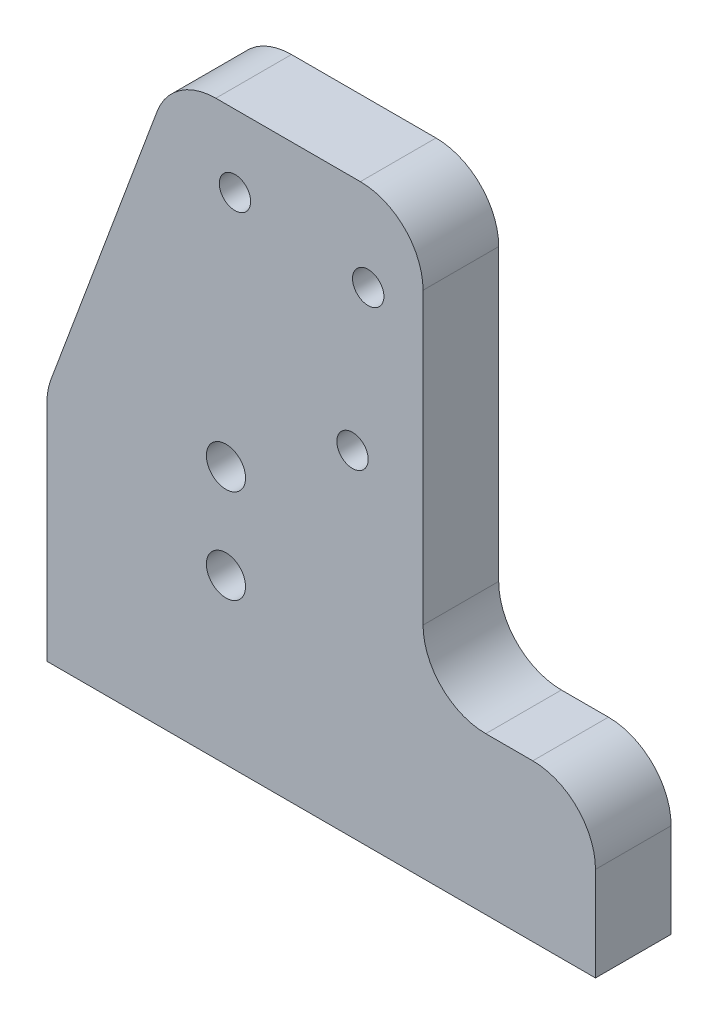
ISO-10303-21;
HEADER;
FILE_DESCRIPTION(('STEP AP214'),'2;1');
FILE_NAME('part.step','',(''),(''),'','','');
FILE_SCHEMA(('AUTOMOTIVE_DESIGN { 1 0 10303 214 1 1 1 1 }'));
ENDSEC;
DATA;
#1=APPLICATION_CONTEXT('core data for automotive mechanical design processes');
#2=APPLICATION_PROTOCOL_DEFINITION('international standard','automotive_design',2000,#1);
#3=PRODUCT_CONTEXT('',#1,'mechanical');
#4=PRODUCT('Part','Part','',(#3));
#5=PRODUCT_RELATED_PRODUCT_CATEGORY('part','',(#4));
#6=PRODUCT_DEFINITION_FORMATION('','',#4);
#7=PRODUCT_DEFINITION_CONTEXT('part definition',#1,'design');
#8=PRODUCT_DEFINITION('design','',#6,#7);
#9=PRODUCT_DEFINITION_SHAPE('','',#8);
#10=(LENGTH_UNIT() NAMED_UNIT(*) SI_UNIT(.MILLI.,.METRE.));
#11=(NAMED_UNIT(*) PLANE_ANGLE_UNIT() SI_UNIT($,.RADIAN.));
#12=(NAMED_UNIT(*) SI_UNIT($,.STERADIAN.) SOLID_ANGLE_UNIT());
#13=UNCERTAINTY_MEASURE_WITH_UNIT(LENGTH_MEASURE(1.E-05),#10,'distance_accuracy_value','');
#14=(GEOMETRIC_REPRESENTATION_CONTEXT(3) GLOBAL_UNCERTAINTY_ASSIGNED_CONTEXT((#13)) GLOBAL_UNIT_ASSIGNED_CONTEXT((#10,
#11,#12)) REPRESENTATION_CONTEXT('',''));
#15=CARTESIAN_POINT('',(0.,0.,0.));
#16=DIRECTION('',(0.,0.,1.));
#17=DIRECTION('',(1.,0.,0.));
#18=AXIS2_PLACEMENT_3D('',#15,#16,#17);
#19=CARTESIAN_POINT('',(16.73,5.,7.239));
#20=DIRECTION('',(0.,-1.,0.));
#21=DIRECTION('',(0.,0.,1.));
#22=AXIS2_PLACEMENT_3D('',#19,#20,#21);
#23=CONICAL_SURFACE('',#22,1.25,1.02974425867665);
#24=CARTESIAN_POINT('',(16.73,5.75107577378445,7.239));
#25=VERTEX_POINT('',#24);
#26=VERTEX_LOOP('',#25);
#27=FACE_BOUND('',#26,.T.);
#28=CARTESIAN_POINT('',(16.73,5.,7.239));
#29=DIRECTION('',(0.,1.,0.));
#30=DIRECTION('',(0.,0.,1.));
#31=AXIS2_PLACEMENT_3D('',#28,#29,#30);
#32=CIRCLE('',#31,1.25);
#33=CARTESIAN_POINT('',(16.73,5.,8.489));
#34=VERTEX_POINT('',#33);
#35=EDGE_CURVE('E191',#34,#34,#32,.T.);
#36=ORIENTED_EDGE('',*,*,#35,.F.);
#37=EDGE_LOOP('',(#36));
#38=FACE_BOUND('',#37,.T.);
#39=ADVANCED_FACE('F49',(#27,#38),#23,.F.);
#40=CARTESIAN_POINT('',(16.73,0.,7.239));
#41=DIRECTION('',(0.,-1.,0.));
#42=DIRECTION('',(0.,0.,1.));
#43=AXIS2_PLACEMENT_3D('',#40,#41,#42);
#44=CYLINDRICAL_SURFACE('',#43,1.24999999999999);
#45=ORIENTED_EDGE('',*,*,#35,.T.);
#46=EDGE_LOOP('',(#45));
#47=FACE_BOUND('',#46,.T.);
#48=CARTESIAN_POINT('',(16.73,-1.5,7.239));
#49=DIRECTION('',(0.,1.,0.));
#50=DIRECTION('',(1.,0.,0.));
#51=AXIS2_PLACEMENT_3D('',#48,#49,#50);
#52=CIRCLE('',#51,1.24999999999999);
#53=CARTESIAN_POINT('',(17.98,-1.5,7.239));
#54=VERTEX_POINT('',#53);
#55=EDGE_CURVE('E172',#54,#54,#52,.T.);
#56=ORIENTED_EDGE('',*,*,#55,.F.);
#57=EDGE_LOOP('',(#56));
#58=FACE_BOUND('',#57,.T.);
#59=ADVANCED_FACE('F297',(#47,#58),#44,.F.);
#60=CARTESIAN_POINT('',(0.,-1.5,9.652));
#61=DIRECTION('',(0.,1.,0.));
#62=DIRECTION('',(-1.,0.,0.));
#63=AXIS2_PLACEMENT_3D('',#60,#61,#62);
#64=PLANE('',#63);
#65=DIRECTION('',(0.,0.,1.));
#66=VECTOR('',#65,1.);
#67=CARTESIAN_POINT('',(0.,-1.5,9.652));
#68=LINE('',#67,#66);
#69=CARTESIAN_POINT('',(0.,-1.5,4.826));
#70=VERTEX_POINT('',#69);
#71=CARTESIAN_POINT('',(0.,-1.5,9.652));
#72=VERTEX_POINT('',#71);
#73=EDGE_CURVE('E165',#70,#72,#68,.T.);
#74=ORIENTED_EDGE('',*,*,#73,.F.);
#75=DIRECTION('',(-1.,0.,0.));
#76=VECTOR('',#75,1.);
#77=CARTESIAN_POINT('',(0.,-1.5,4.826));
#78=LINE('',#77,#76);
#79=CARTESIAN_POINT('',(35.,-1.5,4.826));
#80=VERTEX_POINT('',#79);
#81=EDGE_CURVE('E180',#80,#70,#78,.T.);
#82=ORIENTED_EDGE('',*,*,#81,.F.);
#83=DIRECTION('',(0.,0.,-1.));
#84=VECTOR('',#83,1.);
#85=CARTESIAN_POINT('',(35.,-1.5,9.652));
#86=LINE('',#85,#84);
#87=CARTESIAN_POINT('',(35.,-1.5,9.652));
#88=VERTEX_POINT('',#87);
#89=EDGE_CURVE('E167',#88,#80,#86,.T.);
#90=ORIENTED_EDGE('',*,*,#89,.F.);
#91=DIRECTION('',(1.,0.,0.));
#92=VECTOR('',#91,1.);
#93=CARTESIAN_POINT('',(0.,-1.5,9.652));
#94=LINE('',#93,#92);
#95=EDGE_CURVE('E149',#72,#88,#94,.T.);
#96=ORIENTED_EDGE('',*,*,#95,.F.);
#97=EDGE_LOOP('',(#74,#82,#90,#96));
#98=FACE_BOUND('',#97,.T.);
#99=ORIENTED_EDGE('',*,*,#55,.T.);
#100=EDGE_LOOP('',(#99));
#101=FACE_BOUND('',#100,.T.);
#102=CARTESIAN_POINT('',(28.73,-1.5,7.239));
#103=DIRECTION('',(0.,1.,0.));
#104=DIRECTION('',(1.,0.,0.));
#105=AXIS2_PLACEMENT_3D('',#102,#103,#104);
#106=CIRCLE('',#105,1.25);
#107=CARTESIAN_POINT('',(29.98,-1.5,7.239));
#108=VERTEX_POINT('',#107);
#109=EDGE_CURVE('E175',#108,#108,#106,.T.);
#110=ORIENTED_EDGE('',*,*,#109,.T.);
#111=EDGE_LOOP('',(#110));
#112=FACE_BOUND('',#111,.T.);
#113=ADVANCED_FACE('F162',(#98,#101,#112),#64,.F.);
#114=CARTESIAN_POINT('',(10.7795608360761,31.,4.826));
#115=DIRECTION('',(0.,0.,-1.));
#116=DIRECTION('',(1.,0.,0.));
#117=AXIS2_PLACEMENT_3D('',#114,#115,#116);
#118=CYLINDRICAL_SURFACE('',#117,4.);
#119=CARTESIAN_POINT('',(10.7795608360761,31.,4.826));
#120=DIRECTION('',(0.,0.,1.));
#121=DIRECTION('',(1.,0.,0.));
#122=AXIS2_PLACEMENT_3D('',#119,#120,#121);
#123=CIRCLE('',#122,4.);
#124=CARTESIAN_POINT('',(10.7795608360761,35.,4.826));
#125=VERTEX_POINT('',#124);
#126=CARTESIAN_POINT('',(7.03067343184584,32.3949348480857,4.826));
#127=VERTEX_POINT('',#126);
#128=EDGE_CURVE('E249',#125,#127,#123,.T.);
#129=ORIENTED_EDGE('',*,*,#128,.T.);
#130=DIRECTION('',(0.,0.,1.));
#131=VECTOR('',#130,1.);
#132=CARTESIAN_POINT('',(7.03067343184583,32.3949348480857,9.652));
#133=LINE('',#132,#131);
#134=CARTESIAN_POINT('',(7.03067343184584,32.3949348480857,9.652));
#135=VERTEX_POINT('',#134);
#136=EDGE_CURVE('E239',#127,#135,#133,.T.);
#137=ORIENTED_EDGE('',*,*,#136,.T.);
#138=CARTESIAN_POINT('',(10.7795608360761,31.,9.652));
#139=DIRECTION('',(0.,0.,1.));
#140=DIRECTION('',(1.,0.,0.));
#141=AXIS2_PLACEMENT_3D('',#138,#139,#140);
#142=CIRCLE('',#141,4.);
#143=CARTESIAN_POINT('',(10.7795608360761,35.,9.652));
#144=VERTEX_POINT('',#143);
#145=EDGE_CURVE('E235',#135,#144,#142,.F.);
#146=ORIENTED_EDGE('',*,*,#145,.T.);
#147=DIRECTION('',(0.,0.,1.));
#148=VECTOR('',#147,1.);
#149=CARTESIAN_POINT('',(10.7795608360761,35.,4.826));
#150=LINE('',#149,#148);
#151=EDGE_CURVE('E258',#144,#125,#150,.F.);
#152=ORIENTED_EDGE('',*,*,#151,.T.);
#153=EDGE_LOOP('',(#129,#137,#146,#152));
#154=FACE_BOUND('',#153,.T.);
#155=ADVANCED_FACE('F365',(#154),#118,.T.);
#156=CARTESIAN_POINT('',(0.,35.,4.826));
#157=DIRECTION('',(0.,1.,0.));
#158=DIRECTION('',(-1.,0.,0.));
#159=AXIS2_PLACEMENT_3D('',#156,#157,#158);
#160=PLANE('',#159);
#161=DIRECTION('',(1.,0.,0.));
#162=VECTOR('',#161,1.);
#163=CARTESIAN_POINT('',(0.,35.,9.652));
#164=LINE('',#163,#162);
#165=CARTESIAN_POINT('',(20.,35.,9.652));
#166=VERTEX_POINT('',#165);
#167=EDGE_CURVE('E203',#144,#166,#164,.T.);
#168=ORIENTED_EDGE('',*,*,#167,.T.);
#169=DIRECTION('',(0.,0.,1.));
#170=VECTOR('',#169,1.);
#171=CARTESIAN_POINT('',(20.,35.,4.826));
#172=LINE('',#171,#170);
#173=CARTESIAN_POINT('',(20.,35.,4.826));
#174=VERTEX_POINT('',#173);
#175=EDGE_CURVE('E255',#174,#166,#172,.T.);
#176=ORIENTED_EDGE('',*,*,#175,.F.);
#177=DIRECTION('',(1.,0.,0.));
#178=VECTOR('',#177,1.);
#179=CARTESIAN_POINT('',(0.,35.,4.826));
#180=LINE('',#179,#178);
#181=EDGE_CURVE('E204',#125,#174,#180,.T.);
#182=ORIENTED_EDGE('',*,*,#181,.F.);
#183=ORIENTED_EDGE('',*,*,#151,.F.);
#184=EDGE_LOOP('',(#168,#176,#182,#183));
#185=FACE_BOUND('',#184,.T.);
#186=ADVANCED_FACE('F293',(#185),#160,.T.);
#187=CARTESIAN_POINT('',(20.,31.,4.826));
#188=DIRECTION('',(0.,0.,1.));
#189=DIRECTION('',(-1.,0.,0.));
#190=AXIS2_PLACEMENT_3D('',#187,#188,#189);
#191=CYLINDRICAL_SURFACE('',#190,4.);
#192=CARTESIAN_POINT('',(20.,31.,4.826));
#193=DIRECTION('',(0.,0.,1.));
#194=DIRECTION('',(1.,0.,0.));
#195=AXIS2_PLACEMENT_3D('',#192,#193,#194);
#196=CIRCLE('',#195,4.);
#197=CARTESIAN_POINT('',(24.,31.,4.826));
#198=VERTEX_POINT('',#197);
#199=EDGE_CURVE('E245',#198,#174,#196,.T.);
#200=ORIENTED_EDGE('',*,*,#199,.T.);
#201=ORIENTED_EDGE('',*,*,#175,.T.);
#202=CARTESIAN_POINT('',(20.,31.,9.652));
#203=DIRECTION('',(0.,0.,1.));
#204=DIRECTION('',(1.,0.,0.));
#205=AXIS2_PLACEMENT_3D('',#202,#203,#204);
#206=CIRCLE('',#205,4.);
#207=CARTESIAN_POINT('',(24.,31.,9.652));
#208=VERTEX_POINT('',#207);
#209=EDGE_CURVE('E229',#166,#208,#206,.F.);
#210=ORIENTED_EDGE('',*,*,#209,.T.);
#211=DIRECTION('',(0.,0.,1.));
#212=VECTOR('',#211,1.);
#213=CARTESIAN_POINT('',(24.,31.,4.826));
#214=LINE('',#213,#212);
#215=EDGE_CURVE('E269',#208,#198,#214,.F.);
#216=ORIENTED_EDGE('',*,*,#215,.T.);
#217=EDGE_LOOP('',(#200,#201,#210,#216));
#218=FACE_BOUND('',#217,.T.);
#219=ADVANCED_FACE('F51',(#218),#191,.T.);
#220=CARTESIAN_POINT('',(24.,0.,4.826));
#221=DIRECTION('',(1.,0.,0.));
#222=DIRECTION('',(0.,1.,0.));
#223=AXIS2_PLACEMENT_3D('',#220,#221,#222);
#224=PLANE('',#223);
#225=DIRECTION('',(0.,-1.,0.));
#226=VECTOR('',#225,1.);
#227=CARTESIAN_POINT('',(24.,0.,4.826));
#228=LINE('',#227,#226);
#229=CARTESIAN_POINT('',(24.,12.5,4.826));
#230=VERTEX_POINT('',#229);
#231=EDGE_CURVE('E70',#198,#230,#228,.T.);
#232=ORIENTED_EDGE('',*,*,#231,.F.);
#233=ORIENTED_EDGE('',*,*,#215,.F.);
#234=DIRECTION('',(0.,-1.,0.));
#235=VECTOR('',#234,1.);
#236=CARTESIAN_POINT('',(24.,0.,9.652));
#237=LINE('',#236,#235);
#238=CARTESIAN_POINT('',(24.,12.5,9.652));
#239=VERTEX_POINT('',#238);
#240=EDGE_CURVE('E208',#208,#239,#237,.T.);
#241=ORIENTED_EDGE('',*,*,#240,.T.);
#242=DIRECTION('',(0.,0.,1.));
#243=VECTOR('',#242,1.);
#244=CARTESIAN_POINT('',(24.,12.5,9.652));
#245=LINE('',#244,#243);
#246=EDGE_CURVE('E271',#230,#239,#245,.T.);
#247=ORIENTED_EDGE('',*,*,#246,.F.);
#248=EDGE_LOOP('',(#232,#233,#241,#247));
#249=FACE_BOUND('',#248,.T.);
#250=ADVANCED_FACE('F286',(#249),#224,.T.);
#251=CARTESIAN_POINT('',(28.,12.5,4.826));
#252=DIRECTION('',(0.,0.,-1.));
#253=DIRECTION('',(1.,0.,0.));
#254=AXIS2_PLACEMENT_3D('',#251,#252,#253);
#255=CYLINDRICAL_SURFACE('',#254,4.);
#256=CARTESIAN_POINT('',(28.,12.5,4.826));
#257=DIRECTION('',(0.,0.,1.));
#258=DIRECTION('',(1.,0.,0.));
#259=AXIS2_PLACEMENT_3D('',#256,#257,#258);
#260=CIRCLE('',#259,4.);
#261=CARTESIAN_POINT('',(28.,8.5,4.826));
#262=VERTEX_POINT('',#261);
#263=EDGE_CURVE('E11',#262,#230,#260,.F.);
#264=ORIENTED_EDGE('',*,*,#263,.T.);
#265=ORIENTED_EDGE('',*,*,#246,.T.);
#266=CARTESIAN_POINT('',(28.,12.5,9.652));
#267=DIRECTION('',(0.,0.,1.));
#268=DIRECTION('',(1.,0.,0.));
#269=AXIS2_PLACEMENT_3D('',#266,#267,#268);
#270=CIRCLE('',#269,4.);
#271=CARTESIAN_POINT('',(28.,8.5,9.652));
#272=VERTEX_POINT('',#271);
#273=EDGE_CURVE('E58',#239,#272,#270,.T.);
#274=ORIENTED_EDGE('',*,*,#273,.T.);
#275=DIRECTION('',(0.,0.,1.));
#276=VECTOR('',#275,1.);
#277=CARTESIAN_POINT('',(28.,8.5,4.826));
#278=LINE('',#277,#276);
#279=EDGE_CURVE('E261',#272,#262,#278,.F.);
#280=ORIENTED_EDGE('',*,*,#279,.T.);
#281=EDGE_LOOP('',(#264,#265,#274,#280));
#282=FACE_BOUND('',#281,.T.);
#283=ADVANCED_FACE('F274',(#282),#255,.F.);
#284=CARTESIAN_POINT('',(0.,8.5,4.826));
#285=DIRECTION('',(0.,1.,0.));
#286=DIRECTION('',(0.,0.,-1.));
#287=AXIS2_PLACEMENT_3D('',#284,#285,#286);
#288=PLANE('',#287);
#289=DIRECTION('',(1.,0.,0.));
#290=VECTOR('',#289,1.);
#291=CARTESIAN_POINT('',(0.,8.5,4.826));
#292=LINE('',#291,#290);
#293=CARTESIAN_POINT('',(31.,8.5,4.826));
#294=VERTEX_POINT('',#293);
#295=EDGE_CURVE('E214',#262,#294,#292,.T.);
#296=ORIENTED_EDGE('',*,*,#295,.F.);
#297=ORIENTED_EDGE('',*,*,#279,.F.);
#298=DIRECTION('',(1.,0.,0.));
#299=VECTOR('',#298,1.);
#300=CARTESIAN_POINT('',(0.,8.5,9.652));
#301=LINE('',#300,#299);
#302=CARTESIAN_POINT('',(31.,8.5,9.652));
#303=VERTEX_POINT('',#302);
#304=EDGE_CURVE('E223',#272,#303,#301,.T.);
#305=ORIENTED_EDGE('',*,*,#304,.T.);
#306=DIRECTION('',(0.,0.,1.));
#307=VECTOR('',#306,1.);
#308=CARTESIAN_POINT('',(31.,8.5,4.826));
#309=LINE('',#308,#307);
#310=EDGE_CURVE('E263',#294,#303,#309,.T.);
#311=ORIENTED_EDGE('',*,*,#310,.F.);
#312=EDGE_LOOP('',(#296,#297,#305,#311));
#313=FACE_BOUND('',#312,.T.);
#314=ADVANCED_FACE('F278',(#313),#288,.T.);
#315=CARTESIAN_POINT('',(31.,4.5,4.826));
#316=DIRECTION('',(0.,0.,1.));
#317=DIRECTION('',(-1.,0.,0.));
#318=AXIS2_PLACEMENT_3D('',#315,#316,#317);
#319=CYLINDRICAL_SURFACE('',#318,4.);
#320=CARTESIAN_POINT('',(31.,4.5,4.826));
#321=DIRECTION('',(0.,0.,1.));
#322=DIRECTION('',(1.,0.,0.));
#323=AXIS2_PLACEMENT_3D('',#320,#321,#322);
#324=CIRCLE('',#323,4.);
#325=CARTESIAN_POINT('',(35.,4.5,4.826));
#326=VERTEX_POINT('',#325);
#327=EDGE_CURVE('E247',#326,#294,#324,.T.);
#328=ORIENTED_EDGE('',*,*,#327,.T.);
#329=ORIENTED_EDGE('',*,*,#310,.T.);
#330=CARTESIAN_POINT('',(31.,4.5,9.652));
#331=DIRECTION('',(0.,0.,1.));
#332=DIRECTION('',(1.,0.,0.));
#333=AXIS2_PLACEMENT_3D('',#330,#331,#332);
#334=CIRCLE('',#333,4.);
#335=CARTESIAN_POINT('',(35.,4.5,9.652));
#336=VERTEX_POINT('',#335);
#337=EDGE_CURVE('E232',#303,#336,#334,.F.);
#338=ORIENTED_EDGE('',*,*,#337,.T.);
#339=DIRECTION('',(0.,0.,1.));
#340=VECTOR('',#339,1.);
#341=CARTESIAN_POINT('',(35.,4.5,4.826));
#342=LINE('',#341,#340);
#343=EDGE_CURVE('E266',#336,#326,#342,.F.);
#344=ORIENTED_EDGE('',*,*,#343,.T.);
#345=EDGE_LOOP('',(#328,#329,#338,#344));
#346=FACE_BOUND('',#345,.T.);
#347=ADVANCED_FACE('F469',(#346),#319,.T.);
#348=CARTESIAN_POINT('',(-4.41235154394299,1.64180522565321,4.826));
#349=DIRECTION('',(0.937221851057562,-0.348733712021418,0.));
#350=DIRECTION('',(0.348733712021418,0.937221851057562,0.));
#351=AXIS2_PLACEMENT_3D('',#348,#349,#350);
#352=PLANE('',#351);
#353=DIRECTION('',(-0.348733712021418,-0.937221851057562,0.));
#354=VECTOR('',#353,1.);
#355=CARTESIAN_POINT('',(-4.41235154394299,1.64180522565321,9.652));
#356=LINE('',#355,#354);
#357=CARTESIAN_POINT('',(0.251112595769755,14.1748651011312,9.652));
#358=VERTEX_POINT('',#357);
#359=EDGE_CURVE('E158',#135,#358,#356,.T.);
#360=ORIENTED_EDGE('',*,*,#359,.F.);
#361=ORIENTED_EDGE('',*,*,#136,.F.);
#362=DIRECTION('',(-0.348733712021418,-0.937221851057562,0.));
#363=VECTOR('',#362,1.);
#364=CARTESIAN_POINT('',(-4.41235154394299,1.64180522565321,4.826));
#365=LINE('',#364,#363);
#366=CARTESIAN_POINT('',(0.251112595769755,14.1748651011312,4.826));
#367=VERTEX_POINT('',#366);
#368=EDGE_CURVE('E207',#127,#367,#365,.T.);
#369=ORIENTED_EDGE('',*,*,#368,.T.);
#370=DIRECTION('',(0.,0.,1.));
#371=VECTOR('',#370,1.);
#372=CARTESIAN_POINT('',(0.251112595769752,14.1748651011312,4.826));
#373=LINE('',#372,#371);
#374=EDGE_CURVE('E242',#358,#367,#373,.F.);
#375=ORIENTED_EDGE('',*,*,#374,.F.);
#376=EDGE_LOOP('',(#360,#361,#369,#375));
#377=FACE_BOUND('',#376,.T.);
#378=ADVANCED_FACE('F321',(#377),#352,.F.);
#379=CARTESIAN_POINT('',(12.,30.4,4.826));
#380=DIRECTION('',(0.,0.,-1.));
#381=DIRECTION('',(1.,0.,0.));
#382=AXIS2_PLACEMENT_3D('',#379,#380,#381);
#383=CYLINDRICAL_SURFACE('',#382,0.999999999999999);
#384=CARTESIAN_POINT('',(12.,30.4,9.652));
#385=DIRECTION('',(0.,0.,1.));
#386=DIRECTION('',(1.,0.,0.));
#387=AXIS2_PLACEMENT_3D('',#384,#385,#386);
#388=CIRCLE('',#387,0.999999999999999);
#389=CARTESIAN_POINT('',(13.,30.4,9.652));
#390=VERTEX_POINT('',#389);
#391=EDGE_CURVE('E200',#390,#390,#388,.T.);
#392=ORIENTED_EDGE('',*,*,#391,.T.);
#393=EDGE_LOOP('',(#392));
#394=FACE_BOUND('',#393,.T.);
#395=CARTESIAN_POINT('',(12.,30.4,4.826));
#396=DIRECTION('',(0.,0.,1.));
#397=DIRECTION('',(1.,0.,0.));
#398=AXIS2_PLACEMENT_3D('',#395,#396,#397);
#399=CIRCLE('',#398,0.999999999999999);
#400=CARTESIAN_POINT('',(13.,30.4,4.826));
#401=VERTEX_POINT('',#400);
#402=EDGE_CURVE('E197',#401,#401,#399,.T.);
#403=ORIENTED_EDGE('',*,*,#402,.F.);
#404=EDGE_LOOP('',(#403));
#405=FACE_BOUND('',#404,.T.);
#406=ADVANCED_FACE('F317',(#394,#405),#383,.F.);
#407=CARTESIAN_POINT('',(19.5,19.9,14.826));
#408=DIRECTION('',(0.,0.,-1.));
#409=DIRECTION('',(1.,0.,0.));
#410=AXIS2_PLACEMENT_3D('',#407,#408,#409);
#411=CYLINDRICAL_SURFACE('',#410,1.);
#412=CARTESIAN_POINT('',(19.5,19.9,4.826));
#413=DIRECTION('',(0.,0.,1.));
#414=DIRECTION('',(1.,0.,0.));
#415=AXIS2_PLACEMENT_3D('',#412,#413,#414);
#416=CIRCLE('',#415,1.);
#417=CARTESIAN_POINT('',(20.5,19.9,4.826));
#418=VERTEX_POINT('',#417);
#419=EDGE_CURVE('E186',#418,#418,#416,.T.);
#420=ORIENTED_EDGE('',*,*,#419,.F.);
#421=EDGE_LOOP('',(#420));
#422=FACE_BOUND('',#421,.T.);
#423=CARTESIAN_POINT('',(19.5,19.9,9.652));
#424=DIRECTION('',(0.,0.,1.));
#425=DIRECTION('',(1.,0.,0.));
#426=AXIS2_PLACEMENT_3D('',#423,#424,#425);
#427=CIRCLE('',#426,1.);
#428=CARTESIAN_POINT('',(20.5,19.9,9.652));
#429=VERTEX_POINT('',#428);
#430=EDGE_CURVE('E53',#429,#429,#427,.T.);
#431=ORIENTED_EDGE('',*,*,#430,.T.);
#432=EDGE_LOOP('',(#431));
#433=FACE_BOUND('',#432,.T.);
#434=ADVANCED_FACE('F320',(#422,#433),#411,.F.);
#435=CARTESIAN_POINT('',(20.5,29.4,9.652));
#436=DIRECTION('',(0.,0.,-1.));
#437=DIRECTION('',(1.,0.,0.));
#438=AXIS2_PLACEMENT_3D('',#435,#436,#437);
#439=CYLINDRICAL_SURFACE('',#438,1.);
#440=CARTESIAN_POINT('',(20.5,29.4,9.652));
#441=DIRECTION('',(0.,0.,1.));
#442=DIRECTION('',(1.,0.,0.));
#443=AXIS2_PLACEMENT_3D('',#440,#441,#442);
#444=CIRCLE('',#443,1.);
#445=CARTESIAN_POINT('',(21.5,29.4,9.652));
#446=VERTEX_POINT('',#445);
#447=EDGE_CURVE('E183',#446,#446,#444,.T.);
#448=ORIENTED_EDGE('',*,*,#447,.T.);
#449=EDGE_LOOP('',(#448));
#450=FACE_BOUND('',#449,.T.);
#451=CARTESIAN_POINT('',(20.5,29.4,4.826));
#452=DIRECTION('',(0.,0.,1.));
#453=DIRECTION('',(1.,0.,0.));
#454=AXIS2_PLACEMENT_3D('',#451,#452,#453);
#455=CIRCLE('',#454,1.);
#456=CARTESIAN_POINT('',(21.5,29.4,4.826));
#457=VERTEX_POINT('',#456);
#458=EDGE_CURVE('E182',#457,#457,#455,.T.);
#459=ORIENTED_EDGE('',*,*,#458,.F.);
#460=EDGE_LOOP('',(#459));
#461=FACE_BOUND('',#460,.T.);
#462=ADVANCED_FACE('F352',(#450,#461),#439,.F.);
#463=CARTESIAN_POINT('',(4.,12.7799302530455,4.826));
#464=DIRECTION('',(0.,0.,-1.));
#465=DIRECTION('',(1.,0.,0.));
#466=AXIS2_PLACEMENT_3D('',#463,#464,#465);
#467=CYLINDRICAL_SURFACE('',#466,4.);
#468=CARTESIAN_POINT('',(4.,12.7799302530455,4.826));
#469=DIRECTION('',(0.,0.,1.));
#470=DIRECTION('',(1.,0.,0.));
#471=AXIS2_PLACEMENT_3D('',#468,#469,#470);
#472=CIRCLE('',#471,4.);
#473=CARTESIAN_POINT('',(0.,12.7799302530455,4.826));
#474=VERTEX_POINT('',#473);
#475=EDGE_CURVE('E252',#367,#474,#472,.T.);
#476=ORIENTED_EDGE('',*,*,#475,.T.);
#477=DIRECTION('',(0.,0.,1.));
#478=VECTOR('',#477,1.);
#479=CARTESIAN_POINT('',(0.,12.7799302530455,9.652));
#480=LINE('',#479,#478);
#481=CARTESIAN_POINT('',(0.,12.7799302530455,9.652));
#482=VERTEX_POINT('',#481);
#483=EDGE_CURVE('E218',#474,#482,#480,.T.);
#484=ORIENTED_EDGE('',*,*,#483,.T.);
#485=CARTESIAN_POINT('',(4.,12.7799302530455,9.652));
#486=DIRECTION('',(0.,0.,1.));
#487=DIRECTION('',(1.,0.,0.));
#488=AXIS2_PLACEMENT_3D('',#485,#486,#487);
#489=CIRCLE('',#488,4.);
#490=EDGE_CURVE('E152',#482,#358,#489,.F.);
#491=ORIENTED_EDGE('',*,*,#490,.T.);
#492=ORIENTED_EDGE('',*,*,#374,.T.);
#493=EDGE_LOOP('',(#476,#484,#491,#492));
#494=FACE_BOUND('',#493,.T.);
#495=ADVANCED_FACE('F358',(#494),#467,.T.);
#496=CARTESIAN_POINT('',(0.,0.,4.826));
#497=DIRECTION('',(-1.,0.,0.));
#498=DIRECTION('',(0.,0.,-1.));
#499=AXIS2_PLACEMENT_3D('',#496,#497,#498);
#500=PLANE('',#499);
#501=DIRECTION('',(0.,1.,0.));
#502=VECTOR('',#501,1.);
#503=CARTESIAN_POINT('',(0.,0.,4.826));
#504=LINE('',#503,#502);
#505=EDGE_CURVE('E170',#70,#474,#504,.T.);
#506=ORIENTED_EDGE('',*,*,#505,.F.);
#507=ORIENTED_EDGE('',*,*,#73,.T.);
#508=DIRECTION('',(0.,1.,0.));
#509=VECTOR('',#508,1.);
#510=CARTESIAN_POINT('',(0.,0.,9.652));
#511=LINE('',#510,#509);
#512=EDGE_CURVE('E146',#72,#482,#511,.T.);
#513=ORIENTED_EDGE('',*,*,#512,.T.);
#514=ORIENTED_EDGE('',*,*,#483,.F.);
#515=EDGE_LOOP('',(#506,#507,#513,#514));
#516=FACE_BOUND('',#515,.T.);
#517=ADVANCED_FACE('F169',(#516),#500,.T.);
#518=CARTESIAN_POINT('',(0.,0.,4.826));
#519=DIRECTION('',(0.,0.,-1.));
#520=DIRECTION('',(1.,0.,0.));
#521=AXIS2_PLACEMENT_3D('',#518,#519,#520);
#522=PLANE('',#521);
#523=CARTESIAN_POINT('',(11.425,14.96,4.826));
#524=DIRECTION('',(0.,0.,1.));
#525=DIRECTION('',(1.,0.,0.));
#526=AXIS2_PLACEMENT_3D('',#523,#524,#525);
#527=CIRCLE('',#526,1.25);
#528=CARTESIAN_POINT('',(12.675,14.96,4.826));
#529=VERTEX_POINT('',#528);
#530=EDGE_CURVE('E377',#529,#529,#527,.T.);
#531=ORIENTED_EDGE('',*,*,#530,.T.);
#532=EDGE_LOOP('',(#531));
#533=FACE_BOUND('',#532,.T.);
#534=CARTESIAN_POINT('',(11.425,8.96,4.826));
#535=DIRECTION('',(0.,0.,1.));
#536=DIRECTION('',(1.,0.,0.));
#537=AXIS2_PLACEMENT_3D('',#534,#535,#536);
#538=CIRCLE('',#537,1.25);
#539=CARTESIAN_POINT('',(12.675,8.96,4.826));
#540=VERTEX_POINT('',#539);
#541=EDGE_CURVE('E378',#540,#540,#538,.T.);
#542=ORIENTED_EDGE('',*,*,#541,.T.);
#543=EDGE_LOOP('',(#542));
#544=FACE_BOUND('',#543,.T.);
#545=ORIENTED_EDGE('',*,*,#458,.T.);
#546=EDGE_LOOP('',(#545));
#547=FACE_BOUND('',#546,.T.);
#548=ORIENTED_EDGE('',*,*,#419,.T.);
#549=EDGE_LOOP('',(#548));
#550=FACE_BOUND('',#549,.T.);
#551=ORIENTED_EDGE('',*,*,#402,.T.);
#552=EDGE_LOOP('',(#551));
#553=FACE_BOUND('',#552,.T.);
#554=ORIENTED_EDGE('',*,*,#368,.F.);
#555=ORIENTED_EDGE('',*,*,#128,.F.);
#556=ORIENTED_EDGE('',*,*,#181,.T.);
#557=ORIENTED_EDGE('',*,*,#199,.F.);
#558=ORIENTED_EDGE('',*,*,#231,.T.);
#559=ORIENTED_EDGE('',*,*,#263,.F.);
#560=ORIENTED_EDGE('',*,*,#295,.T.);
#561=ORIENTED_EDGE('',*,*,#327,.F.);
#562=DIRECTION('',(0.,-1.,0.));
#563=VECTOR('',#562,1.);
#564=CARTESIAN_POINT('',(35.,0.,4.826));
#565=LINE('',#564,#563);
#566=EDGE_CURVE('E212',#326,#80,#565,.T.);
#567=ORIENTED_EDGE('',*,*,#566,.T.);
#568=ORIENTED_EDGE('',*,*,#81,.T.);
#569=ORIENTED_EDGE('',*,*,#505,.T.);
#570=ORIENTED_EDGE('',*,*,#475,.F.);
#571=EDGE_LOOP('',(#554,#555,#556,#557,#558,#559,#560,#561,#567,#568,#569,#570));
#572=FACE_BOUND('',#571,.T.);
#573=ADVANCED_FACE('F281',(#533,#544,#547,#550,#553,#572),#522,.T.);
#574=CARTESIAN_POINT('',(35.,0.,4.826));
#575=DIRECTION('',(1.,0.,0.));
#576=DIRECTION('',(0.,0.,1.));
#577=AXIS2_PLACEMENT_3D('',#574,#575,#576);
#578=PLANE('',#577);
#579=DIRECTION('',(0.,-1.,0.));
#580=VECTOR('',#579,1.);
#581=CARTESIAN_POINT('',(35.,0.,9.652));
#582=LINE('',#581,#580);
#583=EDGE_CURVE('E157',#336,#88,#582,.T.);
#584=ORIENTED_EDGE('',*,*,#583,.T.);
#585=ORIENTED_EDGE('',*,*,#89,.T.);
#586=ORIENTED_EDGE('',*,*,#566,.F.);
#587=ORIENTED_EDGE('',*,*,#343,.F.);
#588=EDGE_LOOP('',(#584,#585,#586,#587));
#589=FACE_BOUND('',#588,.T.);
#590=ADVANCED_FACE('F324',(#589),#578,.T.);
#591=CARTESIAN_POINT('',(0.,0.,9.652));
#592=DIRECTION('',(0.,0.,-1.));
#593=DIRECTION('',(1.,0.,0.));
#594=AXIS2_PLACEMENT_3D('',#591,#592,#593);
#595=PLANE('',#594);
#596=CARTESIAN_POINT('',(11.425,14.96,9.652));
#597=DIRECTION('',(0.,0.,1.));
#598=DIRECTION('',(1.,0.,0.));
#599=AXIS2_PLACEMENT_3D('',#596,#597,#598);
#600=CIRCLE('',#599,1.25);
#601=CARTESIAN_POINT('',(12.675,14.96,9.652));
#602=VERTEX_POINT('',#601);
#603=EDGE_CURVE('E336',#602,#602,#600,.T.);
#604=ORIENTED_EDGE('',*,*,#603,.F.);
#605=EDGE_LOOP('',(#604));
#606=FACE_BOUND('',#605,.T.);
#607=CARTESIAN_POINT('',(11.425,8.96,9.652));
#608=DIRECTION('',(0.,0.,1.));
#609=DIRECTION('',(1.,0.,0.));
#610=AXIS2_PLACEMENT_3D('',#607,#608,#609);
#611=CIRCLE('',#610,1.25);
#612=CARTESIAN_POINT('',(12.675,8.96,9.652));
#613=VERTEX_POINT('',#612);
#614=EDGE_CURVE('E340',#613,#613,#611,.T.);
#615=ORIENTED_EDGE('',*,*,#614,.F.);
#616=EDGE_LOOP('',(#615));
#617=FACE_BOUND('',#616,.T.);
#618=ORIENTED_EDGE('',*,*,#447,.F.);
#619=EDGE_LOOP('',(#618));
#620=FACE_BOUND('',#619,.T.);
#621=ORIENTED_EDGE('',*,*,#430,.F.);
#622=EDGE_LOOP('',(#621));
#623=FACE_BOUND('',#622,.T.);
#624=ORIENTED_EDGE('',*,*,#391,.F.);
#625=EDGE_LOOP('',(#624));
#626=FACE_BOUND('',#625,.T.);
#627=ORIENTED_EDGE('',*,*,#512,.F.);
#628=ORIENTED_EDGE('',*,*,#95,.T.);
#629=ORIENTED_EDGE('',*,*,#583,.F.);
#630=ORIENTED_EDGE('',*,*,#337,.F.);
#631=ORIENTED_EDGE('',*,*,#304,.F.);
#632=ORIENTED_EDGE('',*,*,#273,.F.);
#633=ORIENTED_EDGE('',*,*,#240,.F.);
#634=ORIENTED_EDGE('',*,*,#209,.F.);
#635=ORIENTED_EDGE('',*,*,#167,.F.);
#636=ORIENTED_EDGE('',*,*,#145,.F.);
#637=ORIENTED_EDGE('',*,*,#359,.T.);
#638=ORIENTED_EDGE('',*,*,#490,.F.);
#639=EDGE_LOOP('',(#627,#628,#629,#630,#631,#632,#633,#634,#635,#636,#637,#638));
#640=FACE_BOUND('',#639,.T.);
#641=ADVANCED_FACE('F148',(#606,#617,#620,#623,#626,#640),#595,.F.);
#642=CARTESIAN_POINT('',(28.73,5.,7.239));
#643=DIRECTION('',(0.,-1.,0.));
#644=DIRECTION('',(0.,0.,1.));
#645=AXIS2_PLACEMENT_3D('',#642,#643,#644);
#646=CONICAL_SURFACE('',#645,1.25,1.02974425867665);
#647=CARTESIAN_POINT('',(28.73,5.75107577378445,7.239));
#648=VERTEX_POINT('',#647);
#649=VERTEX_LOOP('',#648);
#650=FACE_BOUND('',#649,.T.);
#651=CARTESIAN_POINT('',(28.73,5.,7.239));
#652=DIRECTION('',(0.,1.,0.));
#653=DIRECTION('',(0.,0.,1.));
#654=AXIS2_PLACEMENT_3D('',#651,#652,#653);
#655=CIRCLE('',#654,1.25);
#656=CARTESIAN_POINT('',(28.73,5.,8.489));
#657=VERTEX_POINT('',#656);
#658=EDGE_CURVE('E194',#657,#657,#655,.T.);
#659=ORIENTED_EDGE('',*,*,#658,.F.);
#660=EDGE_LOOP('',(#659));
#661=FACE_BOUND('',#660,.T.);
#662=ADVANCED_FACE('F312',(#650,#661),#646,.F.);
#663=CARTESIAN_POINT('',(28.73,0.,7.239));
#664=DIRECTION('',(0.,-1.,0.));
#665=DIRECTION('',(0.,0.,1.));
#666=AXIS2_PLACEMENT_3D('',#663,#664,#665);
#667=CYLINDRICAL_SURFACE('',#666,1.24999999999999);
#668=ORIENTED_EDGE('',*,*,#658,.T.);
#669=EDGE_LOOP('',(#668));
#670=FACE_BOUND('',#669,.T.);
#671=ORIENTED_EDGE('',*,*,#109,.F.);
#672=EDGE_LOOP('',(#671));
#673=FACE_BOUND('',#672,.T.);
#674=ADVANCED_FACE('F308',(#670,#673),#667,.F.);
#675=CARTESIAN_POINT('',(11.425,8.96,9.652));
#676=DIRECTION('',(0.,0.,-1.));
#677=DIRECTION('',(1.,0.,0.));
#678=AXIS2_PLACEMENT_3D('',#675,#676,#677);
#679=CYLINDRICAL_SURFACE('',#678,1.25);
#680=ORIENTED_EDGE('',*,*,#614,.T.);
#681=EDGE_LOOP('',(#680));
#682=FACE_BOUND('',#681,.T.);
#683=ORIENTED_EDGE('',*,*,#541,.F.);
#684=EDGE_LOOP('',(#683));
#685=FACE_BOUND('',#684,.T.);
#686=ADVANCED_FACE('F311',(#682,#685),#679,.F.);
#687=CARTESIAN_POINT('',(11.425,14.96,9.652));
#688=DIRECTION('',(0.,0.,-1.));
#689=DIRECTION('',(1.,0.,0.));
#690=AXIS2_PLACEMENT_3D('',#687,#688,#689);
#691=CYLINDRICAL_SURFACE('',#690,1.25);
#692=ORIENTED_EDGE('',*,*,#603,.T.);
#693=EDGE_LOOP('',(#692));
#694=FACE_BOUND('',#693,.T.);
#695=ORIENTED_EDGE('',*,*,#530,.F.);
#696=EDGE_LOOP('',(#695));
#697=FACE_BOUND('',#696,.T.);
#698=ADVANCED_FACE('F368',(#694,#697),#691,.F.);
#699=CLOSED_SHELL('',(#39,#59,#113,#155,#186,#219,#250,#283,#314,#347,#378,#406,#434,#462,#495,
#517,#573,#590,#641,#662,#674,#686,#698));
#700=MANIFOLD_SOLID_BREP('B2',#699);
#701=ADVANCED_BREP_SHAPE_REPRESENTATION('',(#18,#700),#14);
#702=SHAPE_DEFINITION_REPRESENTATION(#9,#701);
ENDSEC;
END-ISO-10303-21;
